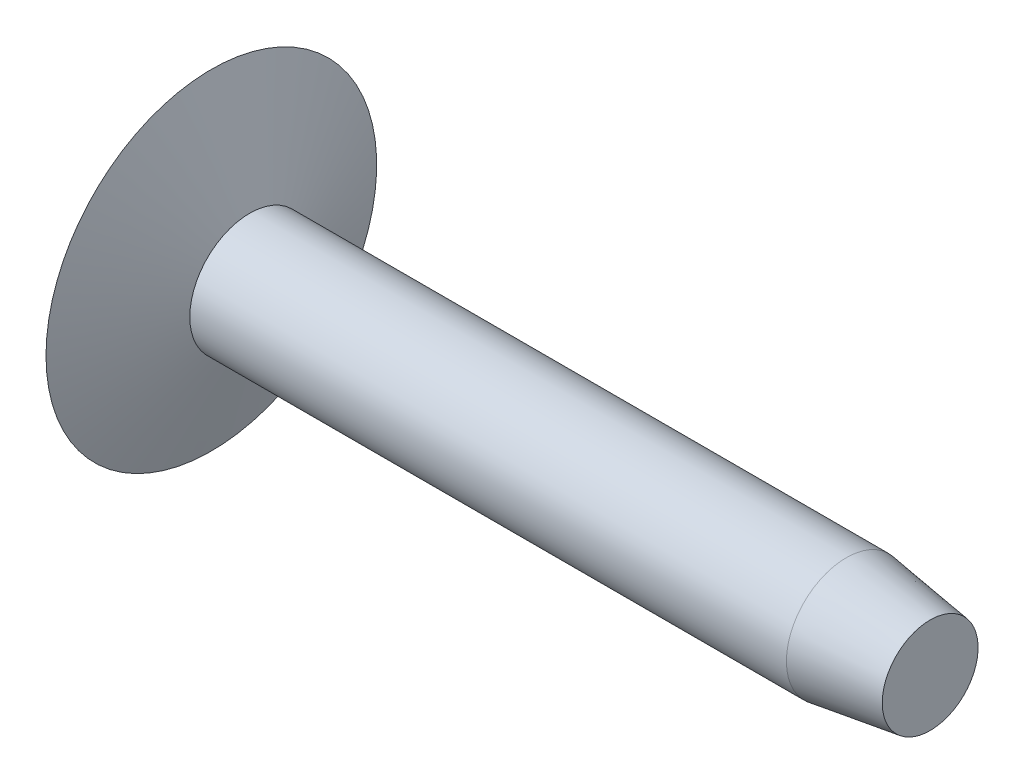
ISO-10303-21;
HEADER;
FILE_DESCRIPTION(('STEP AP214'),'2;1');
FILE_NAME('part.step','',(''),(''),'','','');
FILE_SCHEMA(('AUTOMOTIVE_DESIGN { 1 0 10303 214 1 1 1 1 }'));
ENDSEC;
DATA;
#1=APPLICATION_CONTEXT('core data for automotive mechanical design processes');
#2=APPLICATION_PROTOCOL_DEFINITION('international standard','automotive_design',2000,#1);
#3=PRODUCT_CONTEXT('',#1,'mechanical');
#4=PRODUCT('Part','Part','',(#3));
#5=PRODUCT_RELATED_PRODUCT_CATEGORY('part','',(#4));
#6=PRODUCT_DEFINITION_FORMATION('','',#4);
#7=PRODUCT_DEFINITION_CONTEXT('part definition',#1,'design');
#8=PRODUCT_DEFINITION('design','',#6,#7);
#9=PRODUCT_DEFINITION_SHAPE('','',#8);
#10=(LENGTH_UNIT() NAMED_UNIT(*) SI_UNIT(.MILLI.,.METRE.));
#11=(NAMED_UNIT(*) PLANE_ANGLE_UNIT() SI_UNIT($,.RADIAN.));
#12=(NAMED_UNIT(*) SI_UNIT($,.STERADIAN.) SOLID_ANGLE_UNIT());
#13=UNCERTAINTY_MEASURE_WITH_UNIT(LENGTH_MEASURE(1.E-05),#10,'distance_accuracy_value','');
#14=(GEOMETRIC_REPRESENTATION_CONTEXT(3) GLOBAL_UNCERTAINTY_ASSIGNED_CONTEXT((#13)) GLOBAL_UNIT_ASSIGNED_CONTEXT((#10,
#11,#12)) REPRESENTATION_CONTEXT('',''));
#15=CARTESIAN_POINT('',(0.,0.,0.));
#16=DIRECTION('',(0.,0.,1.));
#17=DIRECTION('',(1.,0.,0.));
#18=AXIS2_PLACEMENT_3D('',#15,#16,#17);
#19=CARTESIAN_POINT('',(0.,0.,0.));
#20=DIRECTION('',(1.,0.,0.));
#21=DIRECTION('',(0.,0.,-1.));
#22=AXIS2_PLACEMENT_3D('',#19,#20,#21);
#23=PLANE('',#22);
#24=CARTESIAN_POINT('',(0.,0.,0.));
#25=DIRECTION('',(-1.,0.,0.));
#26=DIRECTION('',(0.,0.,1.));
#27=AXIS2_PLACEMENT_3D('',#24,#25,#26);
#28=CIRCLE('',#27,6.9);
#29=CARTESIAN_POINT('',(0.,0.,6.9));
#30=VERTEX_POINT('',#29);
#31=EDGE_CURVE('E10',#30,#30,#28,.T.);
#32=ORIENTED_EDGE('',*,*,#31,.T.);
#33=EDGE_LOOP('',(#32));
#34=FACE_BOUND('',#33,.T.);
#35=ADVANCED_FACE('F30',(#34),#23,.F.);
#36=CARTESIAN_POINT('',(1.60146903077127,0.,0.));
#37=DIRECTION('',(-1.,0.,0.));
#38=DIRECTION('',(0.,0.,1.));
#39=AXIS2_PLACEMENT_3D('',#36,#37,#38);
#40=CONICAL_SURFACE('',#39,2.5,1.22173047639603);
#41=ORIENTED_EDGE('',*,*,#31,.F.);
#42=EDGE_LOOP('',(#41));
#43=FACE_BOUND('',#42,.T.);
#44=CARTESIAN_POINT('',(1.60146903077127,0.,0.));
#45=DIRECTION('',(-1.,0.,0.));
#46=DIRECTION('',(0.,0.,1.));
#47=AXIS2_PLACEMENT_3D('',#44,#45,#46);
#48=CIRCLE('',#47,2.5);
#49=CARTESIAN_POINT('',(1.60146903077127,0.,2.5));
#50=VERTEX_POINT('',#49);
#51=EDGE_CURVE('E36',#50,#50,#48,.T.);
#52=ORIENTED_EDGE('',*,*,#51,.T.);
#53=EDGE_LOOP('',(#52));
#54=FACE_BOUND('',#53,.T.);
#55=ADVANCED_FACE('F62',(#43,#54),#40,.T.);
#56=CARTESIAN_POINT('',(0.,0.,0.));
#57=DIRECTION('',(-1.,0.,0.));
#58=DIRECTION('',(0.,0.,1.));
#59=AXIS2_PLACEMENT_3D('',#56,#57,#58);
#60=CYLINDRICAL_SURFACE('',#59,2.5);
#61=ORIENTED_EDGE('',*,*,#51,.F.);
#62=EDGE_LOOP('',(#61));
#63=FACE_BOUND('',#62,.T.);
#64=CARTESIAN_POINT('',(26.5,0.,0.));
#65=DIRECTION('',(-1.,0.,0.));
#66=DIRECTION('',(0.,0.,1.));
#67=AXIS2_PLACEMENT_3D('',#64,#65,#66);
#68=CIRCLE('',#67,2.5);
#69=CARTESIAN_POINT('',(26.5,0.,2.5));
#70=VERTEX_POINT('',#69);
#71=EDGE_CURVE('E40',#70,#70,#68,.T.);
#72=ORIENTED_EDGE('',*,*,#71,.T.);
#73=EDGE_LOOP('',(#72));
#74=FACE_BOUND('',#73,.T.);
#75=ADVANCED_FACE('F58',(#63,#74),#60,.T.);
#76=CARTESIAN_POINT('',(30.,0.,0.));
#77=DIRECTION('',(-1.,0.,0.));
#78=DIRECTION('',(0.,0.,1.));
#79=AXIS2_PLACEMENT_3D('',#76,#77,#78);
#80=CONICAL_SURFACE('',#79,2.,0.141897054604164);
#81=ORIENTED_EDGE('',*,*,#71,.F.);
#82=EDGE_LOOP('',(#81));
#83=FACE_BOUND('',#82,.T.);
#84=CARTESIAN_POINT('',(30.,0.,0.));
#85=DIRECTION('',(-1.,0.,0.));
#86=DIRECTION('',(0.,0.,1.));
#87=AXIS2_PLACEMENT_3D('',#84,#85,#86);
#88=CIRCLE('',#87,2.);
#89=CARTESIAN_POINT('',(30.,0.,2.));
#90=VERTEX_POINT('',#89);
#91=EDGE_CURVE('E44',#90,#90,#88,.T.);
#92=ORIENTED_EDGE('',*,*,#91,.T.);
#93=EDGE_LOOP('',(#92));
#94=FACE_BOUND('',#93,.T.);
#95=ADVANCED_FACE('F50',(#83,#94),#80,.T.);
#96=CARTESIAN_POINT('',(30.,2.,0.));
#97=DIRECTION('',(-1.,0.,0.));
#98=DIRECTION('',(0.,0.,1.));
#99=AXIS2_PLACEMENT_3D('',#96,#97,#98);
#100=PLANE('',#99);
#101=ORIENTED_EDGE('',*,*,#91,.F.);
#102=EDGE_LOOP('',(#101));
#103=FACE_BOUND('',#102,.T.);
#104=ADVANCED_FACE('F52',(#103),#100,.F.);
#105=CLOSED_SHELL('',(#35,#55,#75,#95,#104));
#106=MANIFOLD_SOLID_BREP('B2',#105);
#107=ADVANCED_BREP_SHAPE_REPRESENTATION('',(#18,#106),#14);
#108=SHAPE_DEFINITION_REPRESENTATION(#9,#107);
ENDSEC;
END-ISO-10303-21;
